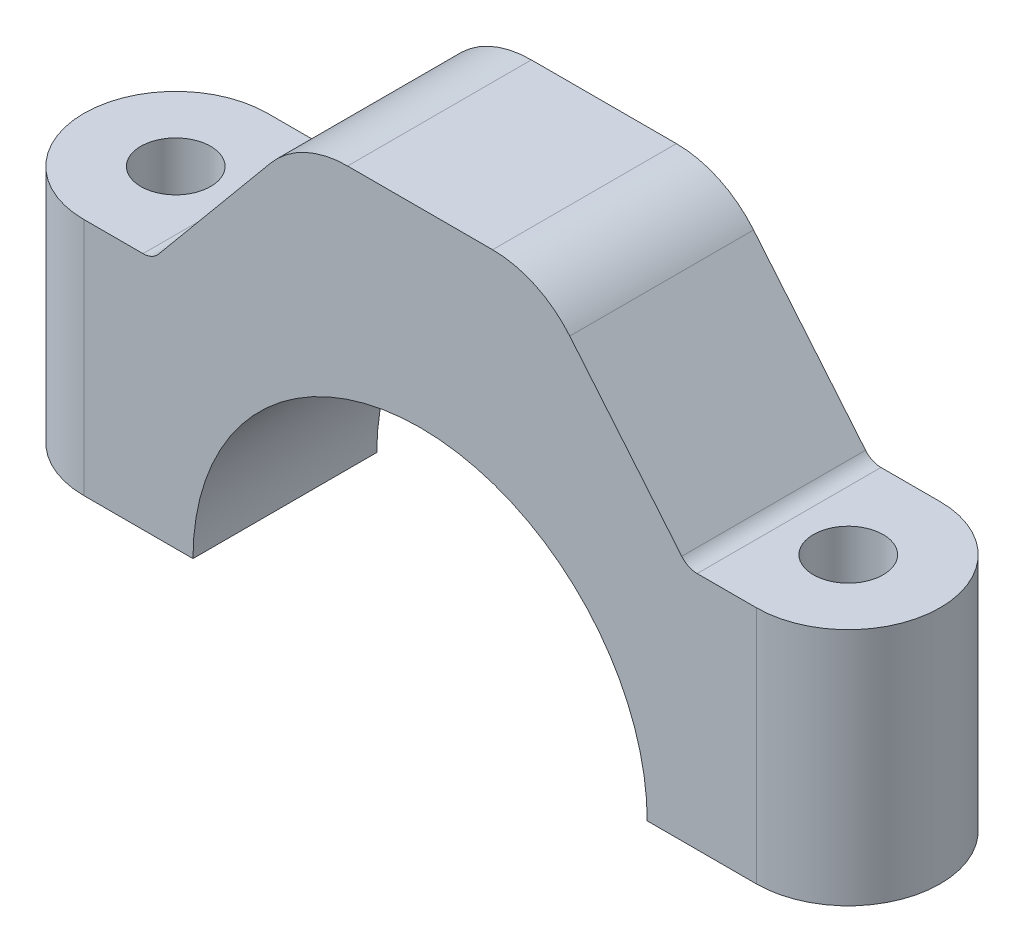
ISO-10303-21;
HEADER;
FILE_DESCRIPTION(('STEP AP214'),'2;1');
FILE_NAME('part.step','',(''),(''),'','','');
FILE_SCHEMA(('AUTOMOTIVE_DESIGN { 1 0 10303 214 1 1 1 1 }'));
ENDSEC;
DATA;
#1=APPLICATION_CONTEXT('core data for automotive mechanical design processes');
#2=APPLICATION_PROTOCOL_DEFINITION('international standard','automotive_design',2000,#1);
#3=PRODUCT_CONTEXT('',#1,'mechanical');
#4=PRODUCT('Part','Part','',(#3));
#5=PRODUCT_RELATED_PRODUCT_CATEGORY('part','',(#4));
#6=PRODUCT_DEFINITION_FORMATION('','',#4);
#7=PRODUCT_DEFINITION_CONTEXT('part definition',#1,'design');
#8=PRODUCT_DEFINITION('design','',#6,#7);
#9=PRODUCT_DEFINITION_SHAPE('','',#8);
#10=(LENGTH_UNIT() NAMED_UNIT(*) SI_UNIT(.MILLI.,.METRE.));
#11=(NAMED_UNIT(*) PLANE_ANGLE_UNIT() SI_UNIT($,.RADIAN.));
#12=(NAMED_UNIT(*) SI_UNIT($,.STERADIAN.) SOLID_ANGLE_UNIT());
#13=UNCERTAINTY_MEASURE_WITH_UNIT(LENGTH_MEASURE(1.E-05),#10,'distance_accuracy_value','');
#14=(GEOMETRIC_REPRESENTATION_CONTEXT(3) GLOBAL_UNCERTAINTY_ASSIGNED_CONTEXT((#13)) GLOBAL_UNIT_ASSIGNED_CONTEXT((#10,
#11,#12)) REPRESENTATION_CONTEXT('',''));
#15=CARTESIAN_POINT('',(0.,0.,0.));
#16=DIRECTION('',(0.,0.,1.));
#17=DIRECTION('',(1.,0.,0.));
#18=AXIS2_PLACEMENT_3D('',#15,#16,#17);
#19=CARTESIAN_POINT('',(-8.76883342284115,8.2042,-2.94941301137823));
#20=DIRECTION('',(0.,0.,1.));
#21=DIRECTION('',(1.,0.,0.));
#22=AXIS2_PLACEMENT_3D('',#19,#20,#21);
#23=CYLINDRICAL_SURFACE('',#22,0.635);
#24=DIRECTION('',(0.,0.,1.));
#25=VECTOR('',#24,1.);
#26=CARTESIAN_POINT('',(-8.28047240175421,7.79833239463721,-2.9083));
#27=LINE('',#26,#25);
#28=CARTESIAN_POINT('',(-8.28047240175421,7.79833239463721,-2.9083));
#29=VERTEX_POINT('',#28);
#30=CARTESIAN_POINT('',(-8.28047240175421,7.79833239463721,2.9083));
#31=VERTEX_POINT('',#30);
#32=EDGE_CURVE('E128',#29,#31,#27,.T.);
#33=ORIENTED_EDGE('',*,*,#32,.F.);
#34=CARTESIAN_POINT('',(-8.76883342284115,8.2042,-2.9083));
#35=DIRECTION('',(0.,0.,1.));
#36=DIRECTION('',(1.,0.,0.));
#37=AXIS2_PLACEMENT_3D('',#34,#35,#36);
#38=CIRCLE('',#37,0.635);
#39=CARTESIAN_POINT('',(-8.76883342284115,7.5692,-2.9083));
#40=VERTEX_POINT('',#39);
#41=EDGE_CURVE('E20',#40,#29,#38,.T.);
#42=ORIENTED_EDGE('',*,*,#41,.F.);
#43=DIRECTION('',(0.,0.,1.));
#44=VECTOR('',#43,1.);
#45=CARTESIAN_POINT('',(-8.76883342284115,7.5692,-2.9083));
#46=LINE('',#45,#44);
#47=CARTESIAN_POINT('',(-8.76883342284115,7.5692,2.9083));
#48=VERTEX_POINT('',#47);
#49=EDGE_CURVE('E188',#48,#40,#46,.F.);
#50=ORIENTED_EDGE('',*,*,#49,.F.);
#51=CARTESIAN_POINT('',(-8.76883342284115,8.2042,2.9083));
#52=DIRECTION('',(0.,0.,1.));
#53=DIRECTION('',(1.,0.,0.));
#54=AXIS2_PLACEMENT_3D('',#51,#52,#53);
#55=CIRCLE('',#54,0.635);
#56=EDGE_CURVE('E129',#31,#48,#55,.F.);
#57=ORIENTED_EDGE('',*,*,#56,.F.);
#58=EDGE_LOOP('',(#33,#42,#50,#57));
#59=FACE_BOUND('',#58,.T.);
#60=ADVANCED_FACE('F17',(#59),#23,.F.);
#61=CARTESIAN_POINT('',(-10.6426,0.,0.));
#62=DIRECTION('',(0.,1.,0.));
#63=DIRECTION('',(0.,0.,1.));
#64=AXIS2_PLACEMENT_3D('',#61,#62,#63);
#65=CYLINDRICAL_SURFACE('',#64,1.1049);
#66=CARTESIAN_POINT('',(-10.6426,0.,0.));
#67=DIRECTION('',(0.,1.,0.));
#68=DIRECTION('',(0.,0.,1.));
#69=AXIS2_PLACEMENT_3D('',#66,#67,#68);
#70=CIRCLE('',#69,1.1049);
#71=CARTESIAN_POINT('',(-10.6426,0.,1.1049));
#72=VERTEX_POINT('',#71);
#73=EDGE_CURVE('E178',#72,#72,#70,.T.);
#74=ORIENTED_EDGE('',*,*,#73,.F.);
#75=EDGE_LOOP('',(#74));
#76=FACE_BOUND('',#75,.T.);
#77=CARTESIAN_POINT('',(-10.6426,7.5692,0.));
#78=DIRECTION('',(0.,1.,0.));
#79=DIRECTION('',(0.,0.,1.));
#80=AXIS2_PLACEMENT_3D('',#77,#78,#79);
#81=CIRCLE('',#80,1.1049);
#82=CARTESIAN_POINT('',(-10.6426,7.5692,1.1049));
#83=VERTEX_POINT('',#82);
#84=EDGE_CURVE('E189',#83,#83,#81,.F.);
#85=ORIENTED_EDGE('',*,*,#84,.F.);
#86=EDGE_LOOP('',(#85));
#87=FACE_BOUND('',#86,.T.);
#88=ADVANCED_FACE('F426',(#76,#87),#65,.F.);
#89=CARTESIAN_POINT('',(10.6426,0.,0.));
#90=DIRECTION('',(0.,-1.,0.));
#91=DIRECTION('',(0.,0.,-1.));
#92=AXIS2_PLACEMENT_3D('',#89,#90,#91);
#93=CYLINDRICAL_SURFACE('',#92,1.1049);
#94=CARTESIAN_POINT('',(10.6426,7.5692,0.));
#95=DIRECTION('',(0.,-1.,0.));
#96=DIRECTION('',(0.,0.,-1.));
#97=AXIS2_PLACEMENT_3D('',#94,#95,#96);
#98=CIRCLE('',#97,1.1049);
#99=CARTESIAN_POINT('',(10.6426,7.5692,-1.1049));
#100=VERTEX_POINT('',#99);
#101=EDGE_CURVE('E168',#100,#100,#98,.T.);
#102=ORIENTED_EDGE('',*,*,#101,.F.);
#103=EDGE_LOOP('',(#102));
#104=FACE_BOUND('',#103,.T.);
#105=CARTESIAN_POINT('',(10.6426,0.,0.));
#106=DIRECTION('',(0.,-1.,0.));
#107=DIRECTION('',(0.,0.,-1.));
#108=AXIS2_PLACEMENT_3D('',#105,#106,#107);
#109=CIRCLE('',#108,1.1049);
#110=CARTESIAN_POINT('',(10.6426,0.,-1.1049));
#111=VERTEX_POINT('',#110);
#112=EDGE_CURVE('E174',#111,#111,#109,.F.);
#113=ORIENTED_EDGE('',*,*,#112,.F.);
#114=EDGE_LOOP('',(#113));
#115=FACE_BOUND('',#114,.T.);
#116=ADVANCED_FACE('F417',(#104,#115),#93,.F.);
#117=CARTESIAN_POINT('',(8.76883342284115,8.2042,-2.94941301137823));
#118=DIRECTION('',(0.,0.,1.));
#119=DIRECTION('',(1.,0.,0.));
#120=AXIS2_PLACEMENT_3D('',#117,#118,#119);
#121=CYLINDRICAL_SURFACE('',#120,0.635);
#122=DIRECTION('',(0.,0.,1.));
#123=VECTOR('',#122,1.);
#124=CARTESIAN_POINT('',(8.76883342284115,7.5692,-2.9083));
#125=LINE('',#124,#123);
#126=CARTESIAN_POINT('',(8.76883342284115,7.5692,-2.9083));
#127=VERTEX_POINT('',#126);
#128=CARTESIAN_POINT('',(8.76883342284115,7.5692,2.9083));
#129=VERTEX_POINT('',#128);
#130=EDGE_CURVE('E165',#127,#129,#125,.T.);
#131=ORIENTED_EDGE('',*,*,#130,.F.);
#132=CARTESIAN_POINT('',(8.76883342284115,8.2042,-2.9083));
#133=DIRECTION('',(0.,0.,1.));
#134=DIRECTION('',(1.,0.,0.));
#135=AXIS2_PLACEMENT_3D('',#132,#133,#134);
#136=CIRCLE('',#135,0.635);
#137=CARTESIAN_POINT('',(8.28047240175421,7.79833239463721,-2.9083));
#138=VERTEX_POINT('',#137);
#139=EDGE_CURVE('E126',#138,#127,#136,.T.);
#140=ORIENTED_EDGE('',*,*,#139,.F.);
#141=DIRECTION('',(0.,0.,1.));
#142=VECTOR('',#141,1.);
#143=CARTESIAN_POINT('',(8.28047240175421,7.79833239463721,-2.9083));
#144=LINE('',#143,#142);
#145=CARTESIAN_POINT('',(8.28047240175421,7.79833239463721,2.9083));
#146=VERTEX_POINT('',#145);
#147=EDGE_CURVE('E152',#146,#138,#144,.F.);
#148=ORIENTED_EDGE('',*,*,#147,.F.);
#149=CARTESIAN_POINT('',(8.76883342284115,8.2042,2.9083));
#150=DIRECTION('',(0.,0.,1.));
#151=DIRECTION('',(1.,0.,0.));
#152=AXIS2_PLACEMENT_3D('',#149,#150,#151);
#153=CIRCLE('',#152,0.635);
#154=EDGE_CURVE('E223',#129,#146,#153,.F.);
#155=ORIENTED_EDGE('',*,*,#154,.F.);
#156=EDGE_LOOP('',(#131,#140,#148,#155));
#157=FACE_BOUND('',#156,.T.);
#158=ADVANCED_FACE('F233',(#157),#121,.F.);
#159=CARTESIAN_POINT('',(0.,0.,2.9083));
#160=DIRECTION('',(0.,0.,1.));
#161=DIRECTION('',(1.,0.,0.));
#162=AXIS2_PLACEMENT_3D('',#159,#160,#161);
#163=PLANE('',#162);
#164=ORIENTED_EDGE('',*,*,#56,.T.);
#165=DIRECTION('',(1.,0.,0.));
#166=VECTOR('',#165,1.);
#167=CARTESIAN_POINT('',(-8.4709,7.5692,2.9083));
#168=LINE('',#167,#166);
#169=CARTESIAN_POINT('',(-10.6426,7.5692,2.9083));
#170=VERTEX_POINT('',#169);
#171=EDGE_CURVE('E132',#170,#48,#168,.T.);
#172=ORIENTED_EDGE('',*,*,#171,.F.);
#173=DIRECTION('',(0.,1.,0.));
#174=VECTOR('',#173,1.);
#175=CARTESIAN_POINT('',(-10.6426,-0.0448767227052676,2.9083));
#176=LINE('',#175,#174);
#177=CARTESIAN_POINT('',(-10.6426,0.,2.9083));
#178=VERTEX_POINT('',#177);
#179=EDGE_CURVE('E197',#178,#170,#176,.T.);
#180=ORIENTED_EDGE('',*,*,#179,.F.);
#181=DIRECTION('',(1.,0.,0.));
#182=VECTOR('',#181,1.);
#183=CARTESIAN_POINT('',(-13.5509,0.,2.9083));
#184=LINE('',#183,#182);
#185=CARTESIAN_POINT('',(-7.1882,0.,2.9083));
#186=VERTEX_POINT('',#185);
#187=EDGE_CURVE('E179',#186,#178,#184,.F.);
#188=ORIENTED_EDGE('',*,*,#187,.F.);
#189=CARTESIAN_POINT('',(0.,0.,2.9083));
#190=DIRECTION('',(0.,0.,1.));
#191=DIRECTION('',(1.,0.,0.));
#192=AXIS2_PLACEMENT_3D('',#189,#190,#191);
#193=CIRCLE('',#192,7.1882);
#194=CARTESIAN_POINT('',(7.1882,0.,2.9083));
#195=VERTEX_POINT('',#194);
#196=EDGE_CURVE('E172',#186,#195,#193,.F.);
#197=ORIENTED_EDGE('',*,*,#196,.T.);
#198=DIRECTION('',(1.,0.,0.));
#199=VECTOR('',#198,1.);
#200=CARTESIAN_POINT('',(7.1882,0.,2.9083));
#201=LINE('',#200,#199);
#202=CARTESIAN_POINT('',(10.6426,0.,2.9083));
#203=VERTEX_POINT('',#202);
#204=EDGE_CURVE('E169',#203,#195,#201,.F.);
#205=ORIENTED_EDGE('',*,*,#204,.F.);
#206=DIRECTION('',(0.,-1.,0.));
#207=VECTOR('',#206,1.);
#208=CARTESIAN_POINT('',(10.6426,7.63636748753527,2.9083));
#209=LINE('',#208,#207);
#210=CARTESIAN_POINT('',(10.6426,7.5692,2.9083));
#211=VERTEX_POINT('',#210);
#212=EDGE_CURVE('E195',#211,#203,#209,.T.);
#213=ORIENTED_EDGE('',*,*,#212,.F.);
#214=DIRECTION('',(1.,0.,0.));
#215=VECTOR('',#214,1.);
#216=CARTESIAN_POINT('',(13.5509,7.5692,2.9083));
#217=LINE('',#216,#215);
#218=EDGE_CURVE('E156',#129,#211,#217,.T.);
#219=ORIENTED_EDGE('',*,*,#218,.F.);
#220=ORIENTED_EDGE('',*,*,#154,.T.);
#221=DIRECTION('',(-0.639161583248489,0.769072474152654,0.));
#222=VECTOR('',#221,1.);
#223=CARTESIAN_POINT('',(8.4709,7.5692,2.9083));
#224=LINE('',#223,#222);
#225=CARTESIAN_POINT('',(4.73673799122894,12.062338026814,2.9083));
#226=VERTEX_POINT('',#225);
#227=EDGE_CURVE('E155',#226,#146,#224,.F.);
#228=ORIENTED_EDGE('',*,*,#227,.F.);
#229=CARTESIAN_POINT('',(2.29493288579427,10.033,2.9083));
#230=DIRECTION('',(0.,0.,-1.));
#231=DIRECTION('',(-1.,0.,0.));
#232=AXIS2_PLACEMENT_3D('',#229,#230,#231);
#233=CIRCLE('',#232,3.175);
#234=CARTESIAN_POINT('',(2.29493288579427,13.208,2.9083));
#235=VERTEX_POINT('',#234);
#236=EDGE_CURVE('E151',#235,#226,#233,.T.);
#237=ORIENTED_EDGE('',*,*,#236,.F.);
#238=DIRECTION('',(1.,0.,0.));
#239=VECTOR('',#238,1.);
#240=CARTESIAN_POINT('',(3.7846,13.208,2.9083));
#241=LINE('',#240,#239);
#242=CARTESIAN_POINT('',(-2.29493288579427,13.208,2.9083));
#243=VERTEX_POINT('',#242);
#244=EDGE_CURVE('E148',#243,#235,#241,.T.);
#245=ORIENTED_EDGE('',*,*,#244,.F.);
#246=CARTESIAN_POINT('',(-2.29493288579427,10.033,2.9083));
#247=DIRECTION('',(0.,0.,-1.));
#248=DIRECTION('',(-1.,0.,0.));
#249=AXIS2_PLACEMENT_3D('',#246,#247,#248);
#250=CIRCLE('',#249,3.175);
#251=CARTESIAN_POINT('',(-4.73673799122894,12.062338026814,2.9083));
#252=VERTEX_POINT('',#251);
#253=EDGE_CURVE('E141',#252,#243,#250,.T.);
#254=ORIENTED_EDGE('',*,*,#253,.F.);
#255=DIRECTION('',(-0.639161583248489,-0.769072474152654,0.));
#256=VECTOR('',#255,1.);
#257=CARTESIAN_POINT('',(-3.7846,13.208,2.9083));
#258=LINE('',#257,#256);
#259=EDGE_CURVE('E133',#31,#252,#258,.F.);
#260=ORIENTED_EDGE('',*,*,#259,.F.);
#261=EDGE_LOOP('',(#164,#172,#180,#188,#197,#205,#213,#219,#220,#228,#237,#245,#254,#260));
#262=FACE_BOUND('',#261,.T.);
#263=ADVANCED_FACE('F258',(#262),#163,.T.);
#264=CARTESIAN_POINT('',(-3.7846,13.208,-2.9083));
#265=DIRECTION('',(-0.769072474152654,0.639161583248489,0.));
#266=DIRECTION('',(-0.639161583248489,-0.769072474152654,0.));
#267=AXIS2_PLACEMENT_3D('',#264,#265,#266);
#268=PLANE('',#267);
#269=DIRECTION('',(-0.639161583248489,-0.769072474152654,0.));
#270=VECTOR('',#269,1.);
#271=CARTESIAN_POINT('',(-4.73673799122895,12.062338026814,-2.9083));
#272=LINE('',#271,#270);
#273=CARTESIAN_POINT('',(-4.73673799122894,12.062338026814,-2.9083));
#274=VERTEX_POINT('',#273);
#275=EDGE_CURVE('E121',#274,#29,#272,.T.);
#276=ORIENTED_EDGE('',*,*,#275,.T.);
#277=ORIENTED_EDGE('',*,*,#32,.T.);
#278=ORIENTED_EDGE('',*,*,#259,.T.);
#279=DIRECTION('',(0.,0.,-1.));
#280=VECTOR('',#279,1.);
#281=CARTESIAN_POINT('',(-4.73673799122894,12.062338026814,2.95641646637697));
#282=LINE('',#281,#280);
#283=EDGE_CURVE('E137',#274,#252,#282,.F.);
#284=ORIENTED_EDGE('',*,*,#283,.F.);
#285=EDGE_LOOP('',(#276,#277,#278,#284));
#286=FACE_BOUND('',#285,.T.);
#287=ADVANCED_FACE('F135',(#286),#268,.T.);
#288=CARTESIAN_POINT('',(-8.4709,7.5692,-2.9083));
#289=DIRECTION('',(0.,1.,0.));
#290=DIRECTION('',(0.,0.,1.));
#291=AXIS2_PLACEMENT_3D('',#288,#289,#290);
#292=PLANE('',#291);
#293=ORIENTED_EDGE('',*,*,#84,.T.);
#294=EDGE_LOOP('',(#293));
#295=FACE_BOUND('',#294,.T.);
#296=ORIENTED_EDGE('',*,*,#171,.T.);
#297=ORIENTED_EDGE('',*,*,#49,.T.);
#298=DIRECTION('',(1.,0.,0.));
#299=VECTOR('',#298,1.);
#300=CARTESIAN_POINT('',(0.,7.5692,-2.9083));
#301=LINE('',#300,#299);
#302=CARTESIAN_POINT('',(-10.6426,7.5692,-2.9083));
#303=VERTEX_POINT('',#302);
#304=EDGE_CURVE('E125',#40,#303,#301,.F.);
#305=ORIENTED_EDGE('',*,*,#304,.T.);
#306=CARTESIAN_POINT('',(-10.6426,7.5692,0.));
#307=DIRECTION('',(0.,1.,0.));
#308=DIRECTION('',(0.,0.,1.));
#309=AXIS2_PLACEMENT_3D('',#306,#307,#308);
#310=CIRCLE('',#309,2.9083);
#311=EDGE_CURVE('E182',#170,#303,#310,.F.);
#312=ORIENTED_EDGE('',*,*,#311,.F.);
#313=EDGE_LOOP('',(#296,#297,#305,#312));
#314=FACE_BOUND('',#313,.T.);
#315=ADVANCED_FACE('F256',(#295,#314),#292,.T.);
#316=CARTESIAN_POINT('',(-10.6426,-0.0448767227052676,0.));
#317=DIRECTION('',(0.,1.,0.));
#318=DIRECTION('',(0.,0.,1.));
#319=AXIS2_PLACEMENT_3D('',#316,#317,#318);
#320=CYLINDRICAL_SURFACE('',#319,2.9083);
#321=ORIENTED_EDGE('',*,*,#179,.T.);
#322=ORIENTED_EDGE('',*,*,#311,.T.);
#323=DIRECTION('',(0.,1.,0.));
#324=VECTOR('',#323,1.);
#325=CARTESIAN_POINT('',(-10.6426,0.,-2.9083));
#326=LINE('',#325,#324);
#327=CARTESIAN_POINT('',(-10.6426,0.,-2.9083));
#328=VERTEX_POINT('',#327);
#329=EDGE_CURVE('E139',#303,#328,#326,.F.);
#330=ORIENTED_EDGE('',*,*,#329,.T.);
#331=CARTESIAN_POINT('',(-10.6426,0.,0.));
#332=DIRECTION('',(0.,1.,0.));
#333=DIRECTION('',(0.,0.,1.));
#334=AXIS2_PLACEMENT_3D('',#331,#332,#333);
#335=CIRCLE('',#334,2.9083);
#336=EDGE_CURVE('E181',#178,#328,#335,.F.);
#337=ORIENTED_EDGE('',*,*,#336,.F.);
#338=EDGE_LOOP('',(#321,#322,#330,#337));
#339=FACE_BOUND('',#338,.T.);
#340=ADVANCED_FACE('F251',(#339),#320,.T.);
#341=CARTESIAN_POINT('',(-13.5509,0.,-2.9083));
#342=DIRECTION('',(0.,-1.,0.));
#343=DIRECTION('',(0.,0.,-1.));
#344=AXIS2_PLACEMENT_3D('',#341,#342,#343);
#345=PLANE('',#344);
#346=ORIENTED_EDGE('',*,*,#73,.T.);
#347=EDGE_LOOP('',(#346));
#348=FACE_BOUND('',#347,.T.);
#349=ORIENTED_EDGE('',*,*,#187,.T.);
#350=ORIENTED_EDGE('',*,*,#336,.T.);
#351=DIRECTION('',(1.,0.,0.));
#352=VECTOR('',#351,1.);
#353=CARTESIAN_POINT('',(0.,0.,-2.9083));
#354=LINE('',#353,#352);
#355=CARTESIAN_POINT('',(-7.1882,0.,-2.9083));
#356=VERTEX_POINT('',#355);
#357=EDGE_CURVE('E185',#328,#356,#354,.T.);
#358=ORIENTED_EDGE('',*,*,#357,.T.);
#359=DIRECTION('',(0.,0.,1.));
#360=VECTOR('',#359,1.);
#361=CARTESIAN_POINT('',(-7.1882,0.,-2.9083));
#362=LINE('',#361,#360);
#363=EDGE_CURVE('E175',#356,#186,#362,.T.);
#364=ORIENTED_EDGE('',*,*,#363,.T.);
#365=EDGE_LOOP('',(#349,#350,#358,#364));
#366=FACE_BOUND('',#365,.T.);
#367=ADVANCED_FACE('F246',(#348,#366),#345,.T.);
#368=CARTESIAN_POINT('',(0.,0.,-2.9083));
#369=DIRECTION('',(0.,0.,1.));
#370=DIRECTION('',(1.,0.,0.));
#371=AXIS2_PLACEMENT_3D('',#368,#369,#370);
#372=CYLINDRICAL_SURFACE('',#371,7.1882);
#373=ORIENTED_EDGE('',*,*,#196,.F.);
#374=ORIENTED_EDGE('',*,*,#363,.F.);
#375=CARTESIAN_POINT('',(0.,0.,-2.9083));
#376=DIRECTION('',(0.,0.,1.));
#377=DIRECTION('',(1.,0.,0.));
#378=AXIS2_PLACEMENT_3D('',#375,#376,#377);
#379=CIRCLE('',#378,7.1882);
#380=CARTESIAN_POINT('',(7.1882,0.,-2.9083));
#381=VERTEX_POINT('',#380);
#382=EDGE_CURVE('E203',#356,#381,#379,.F.);
#383=ORIENTED_EDGE('',*,*,#382,.T.);
#384=DIRECTION('',(0.,0.,-1.));
#385=VECTOR('',#384,1.);
#386=CARTESIAN_POINT('',(7.1882,0.,-2.9083));
#387=LINE('',#386,#385);
#388=EDGE_CURVE('E171',#195,#381,#387,.T.);
#389=ORIENTED_EDGE('',*,*,#388,.F.);
#390=EDGE_LOOP('',(#373,#374,#383,#389));
#391=FACE_BOUND('',#390,.T.);
#392=ADVANCED_FACE('F283',(#391),#372,.F.);
#393=CARTESIAN_POINT('',(7.1882,0.,-2.9083));
#394=DIRECTION('',(0.,-1.,0.));
#395=DIRECTION('',(0.,0.,-1.));
#396=AXIS2_PLACEMENT_3D('',#393,#394,#395);
#397=PLANE('',#396);
#398=ORIENTED_EDGE('',*,*,#112,.T.);
#399=EDGE_LOOP('',(#398));
#400=FACE_BOUND('',#399,.T.);
#401=DIRECTION('',(1.,0.,0.));
#402=VECTOR('',#401,1.);
#403=CARTESIAN_POINT('',(0.,0.,-2.9083));
#404=LINE('',#403,#402);
#405=CARTESIAN_POINT('',(10.6426,0.,-2.9083));
#406=VERTEX_POINT('',#405);
#407=EDGE_CURVE('E164',#381,#406,#404,.T.);
#408=ORIENTED_EDGE('',*,*,#407,.T.);
#409=CARTESIAN_POINT('',(10.6426,0.,0.));
#410=DIRECTION('',(0.,-1.,0.));
#411=DIRECTION('',(0.,0.,-1.));
#412=AXIS2_PLACEMENT_3D('',#409,#410,#411);
#413=CIRCLE('',#412,2.9083);
#414=EDGE_CURVE('E159',#203,#406,#413,.F.);
#415=ORIENTED_EDGE('',*,*,#414,.F.);
#416=ORIENTED_EDGE('',*,*,#204,.T.);
#417=ORIENTED_EDGE('',*,*,#388,.T.);
#418=EDGE_LOOP('',(#408,#415,#416,#417));
#419=FACE_BOUND('',#418,.T.);
#420=ADVANCED_FACE('F279',(#400,#419),#397,.T.);
#421=CARTESIAN_POINT('',(10.6426,7.63636748753527,0.));
#422=DIRECTION('',(0.,-1.,0.));
#423=DIRECTION('',(0.,0.,-1.));
#424=AXIS2_PLACEMENT_3D('',#421,#422,#423);
#425=CYLINDRICAL_SURFACE('',#424,2.9083);
#426=ORIENTED_EDGE('',*,*,#212,.T.);
#427=ORIENTED_EDGE('',*,*,#414,.T.);
#428=DIRECTION('',(0.,1.,0.));
#429=VECTOR('',#428,1.);
#430=CARTESIAN_POINT('',(10.6426,0.,-2.9083));
#431=LINE('',#430,#429);
#432=CARTESIAN_POINT('',(10.6426,7.5692,-2.9083));
#433=VERTEX_POINT('',#432);
#434=EDGE_CURVE('E160',#406,#433,#431,.T.);
#435=ORIENTED_EDGE('',*,*,#434,.T.);
#436=CARTESIAN_POINT('',(10.6426,7.5692,0.));
#437=DIRECTION('',(0.,-1.,0.));
#438=DIRECTION('',(0.,0.,-1.));
#439=AXIS2_PLACEMENT_3D('',#436,#437,#438);
#440=CIRCLE('',#439,2.9083);
#441=EDGE_CURVE('E158',#211,#433,#440,.F.);
#442=ORIENTED_EDGE('',*,*,#441,.F.);
#443=EDGE_LOOP('',(#426,#427,#435,#442));
#444=FACE_BOUND('',#443,.T.);
#445=ADVANCED_FACE('F277',(#444),#425,.T.);
#446=CARTESIAN_POINT('',(13.5509,7.5692,-2.9083));
#447=DIRECTION('',(0.,1.,0.));
#448=DIRECTION('',(0.,0.,1.));
#449=AXIS2_PLACEMENT_3D('',#446,#447,#448);
#450=PLANE('',#449);
#451=ORIENTED_EDGE('',*,*,#101,.T.);
#452=EDGE_LOOP('',(#451));
#453=FACE_BOUND('',#452,.T.);
#454=DIRECTION('',(1.,0.,0.));
#455=VECTOR('',#454,1.);
#456=CARTESIAN_POINT('',(0.,7.5692,-2.9083));
#457=LINE('',#456,#455);
#458=EDGE_CURVE('E163',#433,#127,#457,.F.);
#459=ORIENTED_EDGE('',*,*,#458,.T.);
#460=ORIENTED_EDGE('',*,*,#130,.T.);
#461=ORIENTED_EDGE('',*,*,#218,.T.);
#462=ORIENTED_EDGE('',*,*,#441,.T.);
#463=EDGE_LOOP('',(#459,#460,#461,#462));
#464=FACE_BOUND('',#463,.T.);
#465=ADVANCED_FACE('F236',(#453,#464),#450,.T.);
#466=CARTESIAN_POINT('',(8.4709,7.5692,-2.9083));
#467=DIRECTION('',(0.769072474152654,0.639161583248489,0.));
#468=DIRECTION('',(-0.639161583248489,0.769072474152654,0.));
#469=AXIS2_PLACEMENT_3D('',#466,#467,#468);
#470=PLANE('',#469);
#471=ORIENTED_EDGE('',*,*,#227,.T.);
#472=ORIENTED_EDGE('',*,*,#147,.T.);
#473=DIRECTION('',(-0.639161583248489,0.769072474152654,0.));
#474=VECTOR('',#473,1.);
#475=CARTESIAN_POINT('',(8.28047240175421,7.79833239463721,-2.9083));
#476=LINE('',#475,#474);
#477=CARTESIAN_POINT('',(4.73673799122894,12.062338026814,-2.9083));
#478=VERTEX_POINT('',#477);
#479=EDGE_CURVE('E202',#138,#478,#476,.T.);
#480=ORIENTED_EDGE('',*,*,#479,.T.);
#481=DIRECTION('',(0.,0.,-1.));
#482=VECTOR('',#481,1.);
#483=CARTESIAN_POINT('',(4.73673799122894,12.062338026814,2.95641646637697));
#484=LINE('',#483,#482);
#485=EDGE_CURVE('E149',#226,#478,#484,.T.);
#486=ORIENTED_EDGE('',*,*,#485,.F.);
#487=EDGE_LOOP('',(#471,#472,#480,#486));
#488=FACE_BOUND('',#487,.T.);
#489=ADVANCED_FACE('F272',(#488),#470,.T.);
#490=CARTESIAN_POINT('',(2.29493288579427,10.033,2.95641646637697));
#491=DIRECTION('',(0.,0.,-1.));
#492=DIRECTION('',(-1.,0.,0.));
#493=AXIS2_PLACEMENT_3D('',#490,#491,#492);
#494=CYLINDRICAL_SURFACE('',#493,3.175);
#495=ORIENTED_EDGE('',*,*,#485,.T.);
#496=CARTESIAN_POINT('',(2.29493288579427,10.033,-2.9083));
#497=DIRECTION('',(0.,0.,-1.));
#498=DIRECTION('',(-1.,0.,0.));
#499=AXIS2_PLACEMENT_3D('',#496,#497,#498);
#500=CIRCLE('',#499,3.175);
#501=CARTESIAN_POINT('',(2.29493288579427,13.208,-2.9083));
#502=VERTEX_POINT('',#501);
#503=EDGE_CURVE('E199',#478,#502,#500,.F.);
#504=ORIENTED_EDGE('',*,*,#503,.T.);
#505=DIRECTION('',(0.,0.,1.));
#506=VECTOR('',#505,1.);
#507=CARTESIAN_POINT('',(2.29493288579427,13.208,-2.9083));
#508=LINE('',#507,#506);
#509=EDGE_CURVE('E146',#235,#502,#508,.F.);
#510=ORIENTED_EDGE('',*,*,#509,.F.);
#511=ORIENTED_EDGE('',*,*,#236,.T.);
#512=EDGE_LOOP('',(#495,#504,#510,#511));
#513=FACE_BOUND('',#512,.T.);
#514=ADVANCED_FACE('F268',(#513),#494,.T.);
#515=CARTESIAN_POINT('',(3.7846,13.208,-2.9083));
#516=DIRECTION('',(0.,1.,0.));
#517=DIRECTION('',(0.,0.,1.));
#518=AXIS2_PLACEMENT_3D('',#515,#516,#517);
#519=PLANE('',#518);
#520=ORIENTED_EDGE('',*,*,#244,.T.);
#521=ORIENTED_EDGE('',*,*,#509,.T.);
#522=DIRECTION('',(1.,0.,0.));
#523=VECTOR('',#522,1.);
#524=CARTESIAN_POINT('',(0.,13.208,-2.9083));
#525=LINE('',#524,#523);
#526=CARTESIAN_POINT('',(-2.29493288579427,13.208,-2.9083));
#527=VERTEX_POINT('',#526);
#528=EDGE_CURVE('E26',#502,#527,#525,.F.);
#529=ORIENTED_EDGE('',*,*,#528,.T.);
#530=DIRECTION('',(0.,0.,-1.));
#531=VECTOR('',#530,1.);
#532=CARTESIAN_POINT('',(-2.29493288579427,13.208,2.95641646637697));
#533=LINE('',#532,#531);
#534=EDGE_CURVE('E34',#243,#527,#533,.T.);
#535=ORIENTED_EDGE('',*,*,#534,.F.);
#536=EDGE_LOOP('',(#520,#521,#529,#535));
#537=FACE_BOUND('',#536,.T.);
#538=ADVANCED_FACE('F264',(#537),#519,.T.);
#539=CARTESIAN_POINT('',(-2.29493288579427,10.033,2.95641646637697));
#540=DIRECTION('',(0.,0.,-1.));
#541=DIRECTION('',(-1.,0.,0.));
#542=AXIS2_PLACEMENT_3D('',#539,#540,#541);
#543=CYLINDRICAL_SURFACE('',#542,3.175);
#544=ORIENTED_EDGE('',*,*,#534,.T.);
#545=CARTESIAN_POINT('',(-2.29493288579427,10.033,-2.9083));
#546=DIRECTION('',(0.,0.,-1.));
#547=DIRECTION('',(-1.,0.,0.));
#548=AXIS2_PLACEMENT_3D('',#545,#546,#547);
#549=CIRCLE('',#548,3.175);
#550=EDGE_CURVE('E11',#527,#274,#549,.F.);
#551=ORIENTED_EDGE('',*,*,#550,.T.);
#552=ORIENTED_EDGE('',*,*,#283,.T.);
#553=ORIENTED_EDGE('',*,*,#253,.T.);
#554=EDGE_LOOP('',(#544,#551,#552,#553));
#555=FACE_BOUND('',#554,.T.);
#556=ADVANCED_FACE('F261',(#555),#543,.T.);
#557=CARTESIAN_POINT('',(0.,0.,-2.9083));
#558=DIRECTION('',(0.,0.,1.));
#559=DIRECTION('',(1.,0.,0.));
#560=AXIS2_PLACEMENT_3D('',#557,#558,#559);
#561=PLANE('',#560);
#562=ORIENTED_EDGE('',*,*,#528,.F.);
#563=ORIENTED_EDGE('',*,*,#503,.F.);
#564=ORIENTED_EDGE('',*,*,#479,.F.);
#565=ORIENTED_EDGE('',*,*,#139,.T.);
#566=ORIENTED_EDGE('',*,*,#458,.F.);
#567=ORIENTED_EDGE('',*,*,#434,.F.);
#568=ORIENTED_EDGE('',*,*,#407,.F.);
#569=ORIENTED_EDGE('',*,*,#382,.F.);
#570=ORIENTED_EDGE('',*,*,#357,.F.);
#571=ORIENTED_EDGE('',*,*,#329,.F.);
#572=ORIENTED_EDGE('',*,*,#304,.F.);
#573=ORIENTED_EDGE('',*,*,#41,.T.);
#574=ORIENTED_EDGE('',*,*,#275,.F.);
#575=ORIENTED_EDGE('',*,*,#550,.F.);
#576=EDGE_LOOP('',(#562,#563,#564,#565,#566,#567,#568,#569,#570,#571,#572,#573,#574,#575));
#577=FACE_BOUND('',#576,.T.);
#578=ADVANCED_FACE('F119',(#577),#561,.F.);
#579=CLOSED_SHELL('',(#60,#88,#116,#158,#263,#287,#315,#340,#367,#392,#420,#445,#465,#489,#514,
#538,#556,#578));
#580=MANIFOLD_SOLID_BREP('B1',#579);
#581=ADVANCED_BREP_SHAPE_REPRESENTATION('',(#18,#580),#14);
#582=SHAPE_DEFINITION_REPRESENTATION(#9,#581);
ENDSEC;
END-ISO-10303-21;
